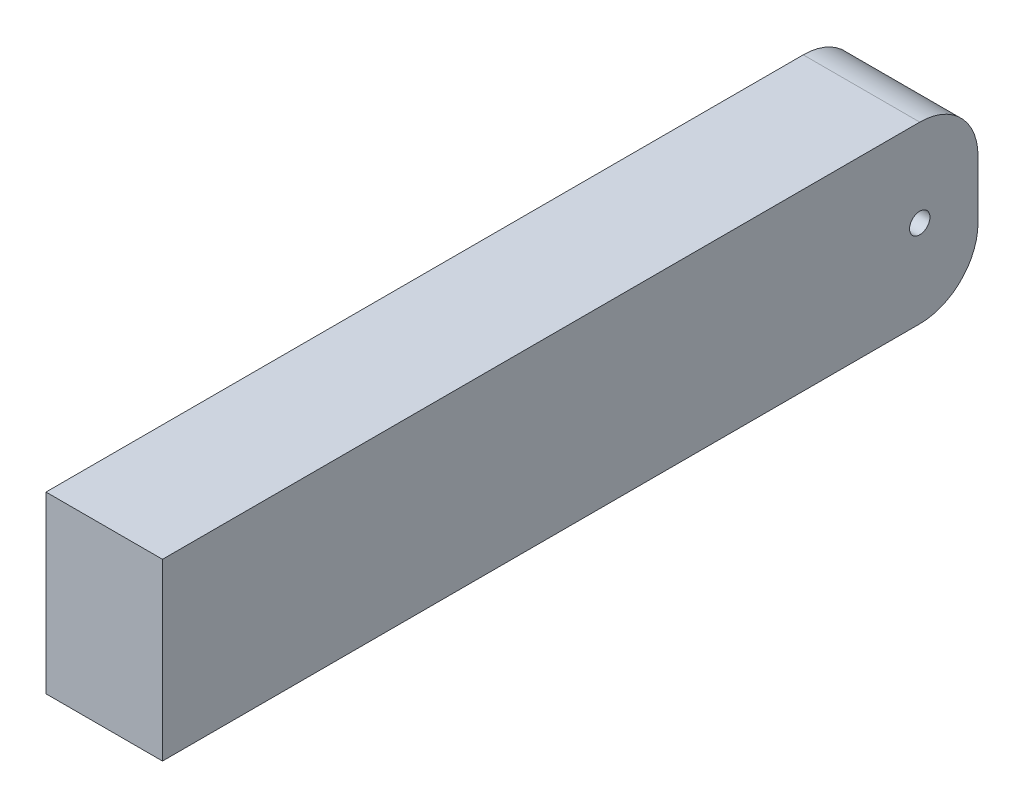
ISO-10303-21;
HEADER;
FILE_DESCRIPTION(('STEP AP214'),'2;1');
FILE_NAME('part.step','',(''),(''),'','','');
FILE_SCHEMA(('AUTOMOTIVE_DESIGN { 1 0 10303 214 1 1 1 1 }'));
ENDSEC;
DATA;
#1=APPLICATION_CONTEXT('core data for automotive mechanical design processes');
#2=APPLICATION_PROTOCOL_DEFINITION('international standard','automotive_design',2000,#1);
#3=PRODUCT_CONTEXT('',#1,'mechanical');
#4=PRODUCT('Part','Part','',(#3));
#5=PRODUCT_RELATED_PRODUCT_CATEGORY('part','',(#4));
#6=PRODUCT_DEFINITION_FORMATION('','',#4);
#7=PRODUCT_DEFINITION_CONTEXT('part definition',#1,'design');
#8=PRODUCT_DEFINITION('design','',#6,#7);
#9=PRODUCT_DEFINITION_SHAPE('','',#8);
#10=(LENGTH_UNIT() NAMED_UNIT(*) SI_UNIT(.MILLI.,.METRE.));
#11=(NAMED_UNIT(*) PLANE_ANGLE_UNIT() SI_UNIT($,.RADIAN.));
#12=(NAMED_UNIT(*) SI_UNIT($,.STERADIAN.) SOLID_ANGLE_UNIT());
#13=UNCERTAINTY_MEASURE_WITH_UNIT(LENGTH_MEASURE(1.E-05),#10,'distance_accuracy_value','');
#14=(GEOMETRIC_REPRESENTATION_CONTEXT(3) GLOBAL_UNCERTAINTY_ASSIGNED_CONTEXT((#13)) GLOBAL_UNIT_ASSIGNED_CONTEXT((#10,
#11,#12)) REPRESENTATION_CONTEXT('',''));
#15=CARTESIAN_POINT('',(0.,0.,0.));
#16=DIRECTION('',(0.,0.,1.));
#17=DIRECTION('',(1.,0.,0.));
#18=AXIS2_PLACEMENT_3D('',#15,#16,#17);
#19=CARTESIAN_POINT('',(-10.,0.,10.));
#20=DIRECTION('',(1.,0.,0.));
#21=DIRECTION('',(0.,1.,0.));
#22=AXIS2_PLACEMENT_3D('',#19,#20,#21);
#23=CYLINDRICAL_SURFACE('',#22,1.75);
#24=CARTESIAN_POINT('',(10.,0.,10.));
#25=DIRECTION('',(1.,0.,0.));
#26=DIRECTION('',(0.,1.,0.));
#27=AXIS2_PLACEMENT_3D('',#24,#25,#26);
#28=CIRCLE('',#27,1.75);
#29=CARTESIAN_POINT('',(10.,1.75,10.));
#30=VERTEX_POINT('',#29);
#31=EDGE_CURVE('E146',#30,#30,#28,.T.);
#32=ORIENTED_EDGE('',*,*,#31,.T.);
#33=EDGE_LOOP('',(#32));
#34=FACE_BOUND('',#33,.T.);
#35=CARTESIAN_POINT('',(5.,0.,10.));
#36=DIRECTION('',(-1.,0.,0.));
#37=DIRECTION('',(0.,-1.,0.));
#38=AXIS2_PLACEMENT_3D('',#35,#36,#37);
#39=CIRCLE('',#38,1.75);
#40=CARTESIAN_POINT('',(5.,-1.75,10.));
#41=VERTEX_POINT('',#40);
#42=EDGE_CURVE('E41',#41,#41,#39,.F.);
#43=ORIENTED_EDGE('',*,*,#42,.F.);
#44=EDGE_LOOP('',(#43));
#45=FACE_BOUND('',#44,.T.);
#46=ADVANCED_FACE('F37',(#34,#45),#23,.F.);
#47=CARTESIAN_POINT('',(10.,15.,140.));
#48=DIRECTION('',(-1.,0.,0.));
#49=DIRECTION('',(0.,-1.,0.));
#50=AXIS2_PLACEMENT_3D('',#47,#48,#49);
#51=PLANE('',#50);
#52=ORIENTED_EDGE('',*,*,#31,.F.);
#53=EDGE_LOOP('',(#52));
#54=FACE_BOUND('',#53,.T.);
#55=DIRECTION('',(0.,0.,-1.));
#56=VECTOR('',#55,1.);
#57=CARTESIAN_POINT('',(10.,-15.,140.));
#58=LINE('',#57,#56);
#59=CARTESIAN_POINT('',(10.,-15.,140.));
#60=VERTEX_POINT('',#59);
#61=CARTESIAN_POINT('',(10.,-15.,10.));
#62=VERTEX_POINT('',#61);
#63=EDGE_CURVE('E142',#60,#62,#58,.T.);
#64=ORIENTED_EDGE('',*,*,#63,.T.);
#65=CARTESIAN_POINT('',(10.,-5.,10.));
#66=DIRECTION('',(-1.,0.,0.));
#67=DIRECTION('',(0.,-1.,0.));
#68=AXIS2_PLACEMENT_3D('',#65,#66,#67);
#69=CIRCLE('',#68,10.);
#70=CARTESIAN_POINT('',(10.,-5.,0.));
#71=VERTEX_POINT('',#70);
#72=EDGE_CURVE('E127',#62,#71,#69,.F.);
#73=ORIENTED_EDGE('',*,*,#72,.T.);
#74=DIRECTION('',(0.,1.,0.));
#75=VECTOR('',#74,1.);
#76=CARTESIAN_POINT('',(10.,15.,0.));
#77=LINE('',#76,#75);
#78=CARTESIAN_POINT('',(10.,5.,0.));
#79=VERTEX_POINT('',#78);
#80=EDGE_CURVE('E144',#71,#79,#77,.T.);
#81=ORIENTED_EDGE('',*,*,#80,.T.);
#82=CARTESIAN_POINT('',(9.99999999999999,5.,10.));
#83=DIRECTION('',(-1.,0.,0.));
#84=DIRECTION('',(0.,-1.,0.));
#85=AXIS2_PLACEMENT_3D('',#82,#83,#84);
#86=CIRCLE('',#85,10.);
#87=CARTESIAN_POINT('',(10.,15.,10.));
#88=VERTEX_POINT('',#87);
#89=EDGE_CURVE('E117',#79,#88,#86,.F.);
#90=ORIENTED_EDGE('',*,*,#89,.T.);
#91=DIRECTION('',(0.,0.,-1.));
#92=VECTOR('',#91,1.);
#93=CARTESIAN_POINT('',(10.,15.,140.));
#94=LINE('',#93,#92);
#95=CARTESIAN_POINT('',(10.,15.,140.));
#96=VERTEX_POINT('',#95);
#97=EDGE_CURVE('E97',#96,#88,#94,.T.);
#98=ORIENTED_EDGE('',*,*,#97,.F.);
#99=DIRECTION('',(0.,1.,0.));
#100=VECTOR('',#99,1.);
#101=CARTESIAN_POINT('',(10.,15.,140.));
#102=LINE('',#101,#100);
#103=EDGE_CURVE('E103',#60,#96,#102,.T.);
#104=ORIENTED_EDGE('',*,*,#103,.F.);
#105=EDGE_LOOP('',(#64,#73,#81,#90,#98,#104));
#106=FACE_BOUND('',#105,.T.);
#107=ADVANCED_FACE('F114',(#54,#106),#51,.F.);
#108=CARTESIAN_POINT('',(-10.,15.,140.));
#109=DIRECTION('',(0.,-1.,0.));
#110=DIRECTION('',(0.,0.,-1.));
#111=AXIS2_PLACEMENT_3D('',#108,#109,#110);
#112=PLANE('',#111);
#113=ORIENTED_EDGE('',*,*,#97,.T.);
#114=DIRECTION('',(-1.,0.,0.));
#115=VECTOR('',#114,1.);
#116=CARTESIAN_POINT('',(-10.,15.,10.));
#117=LINE('',#116,#115);
#118=CARTESIAN_POINT('',(-10.,15.,10.));
#119=VERTEX_POINT('',#118);
#120=EDGE_CURVE('E12',#88,#119,#117,.T.);
#121=ORIENTED_EDGE('',*,*,#120,.T.);
#122=DIRECTION('',(0.,0.,-1.));
#123=VECTOR('',#122,1.);
#124=CARTESIAN_POINT('',(-10.,15.,140.));
#125=LINE('',#124,#123);
#126=CARTESIAN_POINT('',(-10.,15.,140.));
#127=VERTEX_POINT('',#126);
#128=EDGE_CURVE('E99',#127,#119,#125,.T.);
#129=ORIENTED_EDGE('',*,*,#128,.F.);
#130=DIRECTION('',(-1.,0.,0.));
#131=VECTOR('',#130,1.);
#132=CARTESIAN_POINT('',(-10.,15.,140.));
#133=LINE('',#132,#131);
#134=EDGE_CURVE('E93',#96,#127,#133,.T.);
#135=ORIENTED_EDGE('',*,*,#134,.F.);
#136=EDGE_LOOP('',(#113,#121,#129,#135));
#137=FACE_BOUND('',#136,.T.);
#138=ADVANCED_FACE('F95',(#137),#112,.F.);
#139=CARTESIAN_POINT('',(-10.,15.,140.));
#140=DIRECTION('',(1.,0.,0.));
#141=DIRECTION('',(0.,1.,0.));
#142=AXIS2_PLACEMENT_3D('',#139,#140,#141);
#143=PLANE('',#142);
#144=CARTESIAN_POINT('',(-10.,0.,10.));
#145=DIRECTION('',(-1.,0.,0.));
#146=DIRECTION('',(0.,-1.,0.));
#147=AXIS2_PLACEMENT_3D('',#144,#145,#146);
#148=CIRCLE('',#147,4.75);
#149=CARTESIAN_POINT('',(-10.,-4.75,10.));
#150=VERTEX_POINT('',#149);
#151=EDGE_CURVE('E155',#150,#150,#148,.T.);
#152=ORIENTED_EDGE('',*,*,#151,.F.);
#153=EDGE_LOOP('',(#152));
#154=FACE_BOUND('',#153,.T.);
#155=DIRECTION('',(0.,-1.,0.));
#156=VECTOR('',#155,1.);
#157=CARTESIAN_POINT('',(-10.,15.,0.));
#158=LINE('',#157,#156);
#159=CARTESIAN_POINT('',(-10.,5.,0.));
#160=VERTEX_POINT('',#159);
#161=CARTESIAN_POINT('',(-10.,-5.,0.));
#162=VERTEX_POINT('',#161);
#163=EDGE_CURVE('E112',#160,#162,#158,.T.);
#164=ORIENTED_EDGE('',*,*,#163,.T.);
#165=CARTESIAN_POINT('',(-10.,-5.,10.));
#166=DIRECTION('',(1.,0.,0.));
#167=DIRECTION('',(0.,1.,0.));
#168=AXIS2_PLACEMENT_3D('',#165,#166,#167);
#169=CIRCLE('',#168,10.);
#170=CARTESIAN_POINT('',(-10.,-15.,10.));
#171=VERTEX_POINT('',#170);
#172=EDGE_CURVE('E46',#162,#171,#169,.F.);
#173=ORIENTED_EDGE('',*,*,#172,.T.);
#174=DIRECTION('',(0.,0.,-1.));
#175=VECTOR('',#174,1.);
#176=CARTESIAN_POINT('',(-10.,-15.,140.));
#177=LINE('',#176,#175);
#178=CARTESIAN_POINT('',(-10.,-15.,140.));
#179=VERTEX_POINT('',#178);
#180=EDGE_CURVE('E122',#179,#171,#177,.T.);
#181=ORIENTED_EDGE('',*,*,#180,.F.);
#182=DIRECTION('',(0.,-1.,0.));
#183=VECTOR('',#182,1.);
#184=CARTESIAN_POINT('',(-10.,15.,140.));
#185=LINE('',#184,#183);
#186=EDGE_CURVE('E102',#127,#179,#185,.T.);
#187=ORIENTED_EDGE('',*,*,#186,.F.);
#188=ORIENTED_EDGE('',*,*,#128,.T.);
#189=CARTESIAN_POINT('',(-10.,5.,10.));
#190=DIRECTION('',(1.,0.,0.));
#191=DIRECTION('',(0.,1.,0.));
#192=AXIS2_PLACEMENT_3D('',#189,#190,#191);
#193=CIRCLE('',#192,10.);
#194=EDGE_CURVE('E53',#119,#160,#193,.F.);
#195=ORIENTED_EDGE('',*,*,#194,.T.);
#196=EDGE_LOOP('',(#164,#173,#181,#187,#188,#195));
#197=FACE_BOUND('',#196,.T.);
#198=ADVANCED_FACE('F137',(#154,#197),#143,.F.);
#199=CARTESIAN_POINT('',(-10.,-15.,140.));
#200=DIRECTION('',(0.,1.,0.));
#201=DIRECTION('',(0.,0.,1.));
#202=AXIS2_PLACEMENT_3D('',#199,#200,#201);
#203=PLANE('',#202);
#204=ORIENTED_EDGE('',*,*,#180,.T.);
#205=DIRECTION('',(1.,0.,0.));
#206=VECTOR('',#205,1.);
#207=CARTESIAN_POINT('',(-10.,-15.,10.));
#208=LINE('',#207,#206);
#209=EDGE_CURVE('E118',#171,#62,#208,.T.);
#210=ORIENTED_EDGE('',*,*,#209,.T.);
#211=ORIENTED_EDGE('',*,*,#63,.F.);
#212=DIRECTION('',(1.,0.,0.));
#213=VECTOR('',#212,1.);
#214=CARTESIAN_POINT('',(-10.,-15.,140.));
#215=LINE('',#214,#213);
#216=EDGE_CURVE('E108',#179,#60,#215,.T.);
#217=ORIENTED_EDGE('',*,*,#216,.F.);
#218=EDGE_LOOP('',(#204,#210,#211,#217));
#219=FACE_BOUND('',#218,.T.);
#220=ADVANCED_FACE('F141',(#219),#203,.F.);
#221=CARTESIAN_POINT('',(0.,0.,140.));
#222=DIRECTION('',(0.,0.,1.));
#223=DIRECTION('',(1.,0.,0.));
#224=AXIS2_PLACEMENT_3D('',#221,#222,#223);
#225=PLANE('',#224);
#226=ORIENTED_EDGE('',*,*,#103,.T.);
#227=ORIENTED_EDGE('',*,*,#134,.T.);
#228=ORIENTED_EDGE('',*,*,#186,.T.);
#229=ORIENTED_EDGE('',*,*,#216,.T.);
#230=EDGE_LOOP('',(#226,#227,#228,#229));
#231=FACE_BOUND('',#230,.T.);
#232=ADVANCED_FACE('F106',(#231),#225,.T.);
#233=CARTESIAN_POINT('',(0.,0.,0.));
#234=DIRECTION('',(0.,0.,1.));
#235=DIRECTION('',(1.,0.,0.));
#236=AXIS2_PLACEMENT_3D('',#233,#234,#235);
#237=PLANE('',#236);
#238=ORIENTED_EDGE('',*,*,#80,.F.);
#239=DIRECTION('',(1.,0.,0.));
#240=VECTOR('',#239,1.);
#241=CARTESIAN_POINT('',(0.,-5.,0.));
#242=LINE('',#241,#240);
#243=EDGE_CURVE('E60',#71,#162,#242,.F.);
#244=ORIENTED_EDGE('',*,*,#243,.T.);
#245=ORIENTED_EDGE('',*,*,#163,.F.);
#246=DIRECTION('',(-1.,0.,0.));
#247=VECTOR('',#246,1.);
#248=CARTESIAN_POINT('',(0.,5.,0.));
#249=LINE('',#248,#247);
#250=EDGE_CURVE('E129',#160,#79,#249,.F.);
#251=ORIENTED_EDGE('',*,*,#250,.T.);
#252=EDGE_LOOP('',(#238,#244,#245,#251));
#253=FACE_BOUND('',#252,.T.);
#254=ADVANCED_FACE('F145',(#253),#237,.F.);
#255=CARTESIAN_POINT('',(-10.,-5.,10.));
#256=DIRECTION('',(1.,0.,0.));
#257=DIRECTION('',(0.,0.,-1.));
#258=AXIS2_PLACEMENT_3D('',#255,#256,#257);
#259=CYLINDRICAL_SURFACE('',#258,10.);
#260=ORIENTED_EDGE('',*,*,#172,.F.);
#261=ORIENTED_EDGE('',*,*,#243,.F.);
#262=ORIENTED_EDGE('',*,*,#72,.F.);
#263=ORIENTED_EDGE('',*,*,#209,.F.);
#264=EDGE_LOOP('',(#260,#261,#262,#263));
#265=FACE_BOUND('',#264,.T.);
#266=ADVANCED_FACE('F143',(#265),#259,.T.);
#267=CARTESIAN_POINT('',(-10.,5.,10.));
#268=DIRECTION('',(-1.,0.,0.));
#269=DIRECTION('',(0.,0.,1.));
#270=AXIS2_PLACEMENT_3D('',#267,#268,#269);
#271=CYLINDRICAL_SURFACE('',#270,10.);
#272=ORIENTED_EDGE('',*,*,#89,.F.);
#273=ORIENTED_EDGE('',*,*,#250,.F.);
#274=ORIENTED_EDGE('',*,*,#194,.F.);
#275=ORIENTED_EDGE('',*,*,#120,.F.);
#276=EDGE_LOOP('',(#272,#273,#274,#275));
#277=FACE_BOUND('',#276,.T.);
#278=ADVANCED_FACE('F39',(#277),#271,.T.);
#279=CARTESIAN_POINT('',(5.,0.,10.));
#280=DIRECTION('',(-1.,0.,0.));
#281=DIRECTION('',(0.,-1.,0.));
#282=AXIS2_PLACEMENT_3D('',#279,#280,#281);
#283=PLANE('',#282);
#284=CARTESIAN_POINT('',(5.,0.,10.));
#285=DIRECTION('',(-1.,0.,0.));
#286=DIRECTION('',(0.,-1.,0.));
#287=AXIS2_PLACEMENT_3D('',#284,#285,#286);
#288=CIRCLE('',#287,4.75);
#289=CARTESIAN_POINT('',(5.,-4.75,10.));
#290=VERTEX_POINT('',#289);
#291=EDGE_CURVE('E158',#290,#290,#288,.T.);
#292=ORIENTED_EDGE('',*,*,#291,.T.);
#293=EDGE_LOOP('',(#292));
#294=FACE_BOUND('',#293,.T.);
#295=ORIENTED_EDGE('',*,*,#42,.T.);
#296=EDGE_LOOP('',(#295));
#297=FACE_BOUND('',#296,.T.);
#298=ADVANCED_FACE('F165',(#294,#297),#283,.T.);
#299=CARTESIAN_POINT('',(5.,0.,10.));
#300=DIRECTION('',(-1.,0.,0.));
#301=DIRECTION('',(0.,-1.,0.));
#302=AXIS2_PLACEMENT_3D('',#299,#300,#301);
#303=CYLINDRICAL_SURFACE('',#302,4.75);
#304=ORIENTED_EDGE('',*,*,#291,.F.);
#305=EDGE_LOOP('',(#304));
#306=FACE_BOUND('',#305,.T.);
#307=ORIENTED_EDGE('',*,*,#151,.T.);
#308=EDGE_LOOP('',(#307));
#309=FACE_BOUND('',#308,.T.);
#310=ADVANCED_FACE('F177',(#306,#309),#303,.F.);
#311=CLOSED_SHELL('',(#46,#107,#138,#198,#220,#232,#254,#266,#278,#298,#310));
#312=MANIFOLD_SOLID_BREP('B2',#311);
#313=ADVANCED_BREP_SHAPE_REPRESENTATION('',(#18,#312),#14);
#314=SHAPE_DEFINITION_REPRESENTATION(#9,#313);
ENDSEC;
END-ISO-10303-21;
